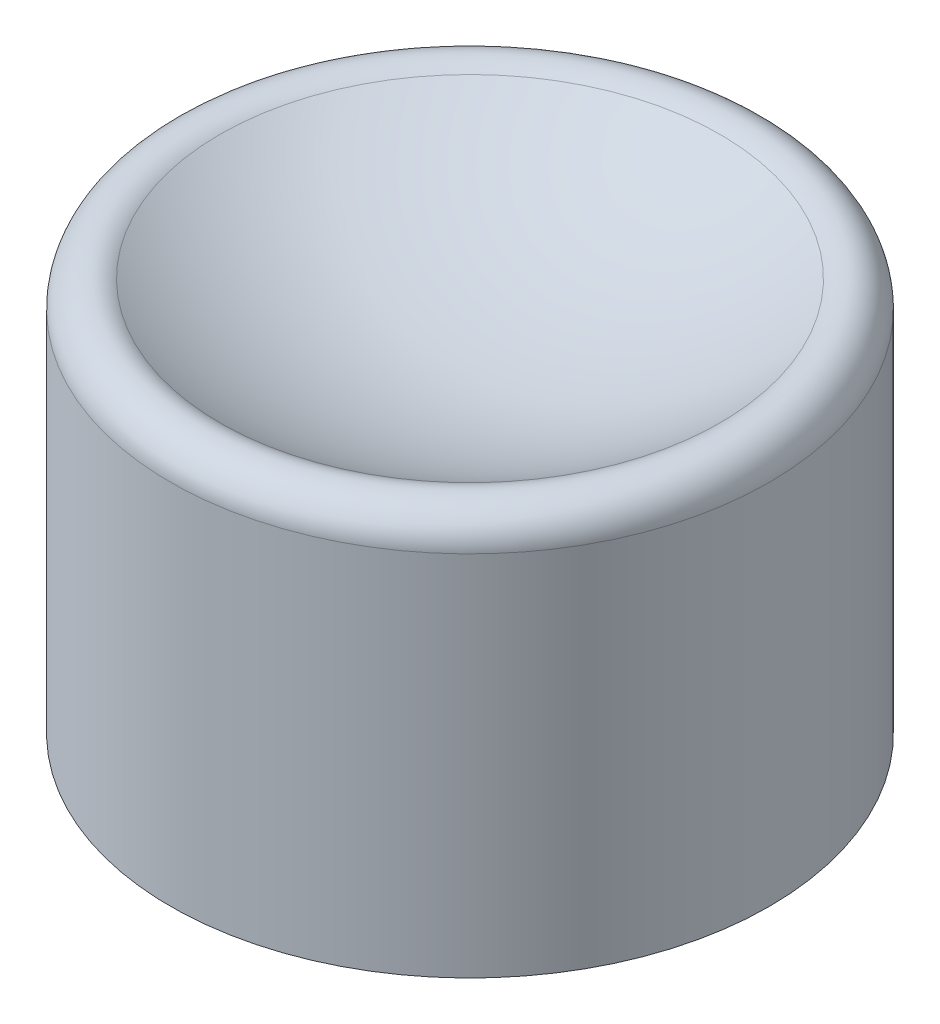
ISO-10303-21;
HEADER;
FILE_DESCRIPTION(('STEP AP214'),'2;1');
FILE_NAME('part.step','',(''),(''),'','','');
FILE_SCHEMA(('AUTOMOTIVE_DESIGN { 1 0 10303 214 1 1 1 1 }'));
ENDSEC;
DATA;
#1=APPLICATION_CONTEXT('core data for automotive mechanical design processes');
#2=APPLICATION_PROTOCOL_DEFINITION('international standard','automotive_design',2000,#1);
#3=PRODUCT_CONTEXT('',#1,'mechanical');
#4=PRODUCT('Part','Part','',(#3));
#5=PRODUCT_RELATED_PRODUCT_CATEGORY('part','',(#4));
#6=PRODUCT_DEFINITION_FORMATION('','',#4);
#7=PRODUCT_DEFINITION_CONTEXT('part definition',#1,'design');
#8=PRODUCT_DEFINITION('design','',#6,#7);
#9=PRODUCT_DEFINITION_SHAPE('','',#8);
#10=(LENGTH_UNIT() NAMED_UNIT(*) SI_UNIT(.MILLI.,.METRE.));
#11=(NAMED_UNIT(*) PLANE_ANGLE_UNIT() SI_UNIT($,.RADIAN.));
#12=(NAMED_UNIT(*) SI_UNIT($,.STERADIAN.) SOLID_ANGLE_UNIT());
#13=UNCERTAINTY_MEASURE_WITH_UNIT(LENGTH_MEASURE(1.E-05),#10,'distance_accuracy_value','');
#14=(GEOMETRIC_REPRESENTATION_CONTEXT(3) GLOBAL_UNCERTAINTY_ASSIGNED_CONTEXT((#13)) GLOBAL_UNIT_ASSIGNED_CONTEXT((#10,
#11,#12)) REPRESENTATION_CONTEXT('',''));
#15=CARTESIAN_POINT('',(0.,0.,0.));
#16=DIRECTION('',(0.,0.,1.));
#17=DIRECTION('',(1.,0.,0.));
#18=AXIS2_PLACEMENT_3D('',#15,#16,#17);
#19=CARTESIAN_POINT('',(-2.0574,0.,0.));
#20=DIRECTION('',(0.,-1.,0.));
#21=DIRECTION('',(1.,0.,0.));
#22=AXIS2_PLACEMENT_3D('',#19,#20,#21);
#23=PLANE('',#22);
#24=CARTESIAN_POINT('',(0.,0.,0.));
#25=DIRECTION('',(0.,1.,0.));
#26=DIRECTION('',(-1.,0.,0.));
#27=AXIS2_PLACEMENT_3D('',#24,#25,#26);
#28=CIRCLE('',#27,1.5494);
#29=CARTESIAN_POINT('',(-1.5494,0.,0.));
#30=VERTEX_POINT('',#29);
#31=EDGE_CURVE('E10',#30,#30,#28,.T.);
#32=ORIENTED_EDGE('',*,*,#31,.T.);
#33=EDGE_LOOP('',(#32));
#34=FACE_BOUND('',#33,.T.);
#35=CARTESIAN_POINT('',(0.,0.,0.));
#36=DIRECTION('',(0.,1.,0.));
#37=DIRECTION('',(-1.,0.,0.));
#38=AXIS2_PLACEMENT_3D('',#35,#36,#37);
#39=CIRCLE('',#38,2.0574);
#40=CARTESIAN_POINT('',(-2.0574,0.,0.));
#41=VERTEX_POINT('',#40);
#42=EDGE_CURVE('E66',#41,#41,#39,.T.);
#43=ORIENTED_EDGE('',*,*,#42,.F.);
#44=EDGE_LOOP('',(#43));
#45=FACE_BOUND('',#44,.T.);
#46=ADVANCED_FACE('F29',(#34,#45),#23,.T.);
#47=CARTESIAN_POINT('',(0.,0.,0.));
#48=DIRECTION('',(0.,1.,0.));
#49=DIRECTION('',(-1.,0.,0.));
#50=AXIS2_PLACEMENT_3D('',#47,#48,#49);
#51=CYLINDRICAL_SURFACE('',#50,1.5494);
#52=CARTESIAN_POINT('',(0.,3.048,0.));
#53=DIRECTION('',(0.,1.,0.));
#54=DIRECTION('',(-1.,0.,0.));
#55=AXIS2_PLACEMENT_3D('',#52,#53,#54);
#56=CIRCLE('',#55,1.5494);
#57=CARTESIAN_POINT('',(-1.5494,3.048,0.));
#58=VERTEX_POINT('',#57);
#59=EDGE_CURVE('E35',#58,#58,#56,.T.);
#60=ORIENTED_EDGE('',*,*,#59,.T.);
#61=EDGE_LOOP('',(#60));
#62=FACE_BOUND('',#61,.T.);
#63=ORIENTED_EDGE('',*,*,#31,.F.);
#64=EDGE_LOOP('',(#63));
#65=FACE_BOUND('',#64,.T.);
#66=ADVANCED_FACE('F74',(#62,#65),#51,.F.);
#67=CARTESIAN_POINT('',(-1.5494,3.048,0.));
#68=DIRECTION('',(0.,-1.,0.));
#69=DIRECTION('',(1.,0.,0.));
#70=AXIS2_PLACEMENT_3D('',#67,#68,#69);
#71=PLANE('',#70);
#72=CARTESIAN_POINT('',(0.,3.048,0.));
#73=DIRECTION('',(0.,1.,0.));
#74=DIRECTION('',(-1.,0.,0.));
#75=AXIS2_PLACEMENT_3D('',#72,#73,#74);
#76=CIRCLE('',#75,0.762);
#77=CARTESIAN_POINT('',(-0.762,3.048,0.));
#78=VERTEX_POINT('',#77);
#79=EDGE_CURVE('E39',#78,#78,#76,.T.);
#80=ORIENTED_EDGE('',*,*,#79,.T.);
#81=EDGE_LOOP('',(#80));
#82=FACE_BOUND('',#81,.T.);
#83=ORIENTED_EDGE('',*,*,#59,.F.);
#84=EDGE_LOOP('',(#83));
#85=FACE_BOUND('',#84,.T.);
#86=ADVANCED_FACE('F78',(#82,#85),#71,.T.);
#87=CARTESIAN_POINT('',(0.,0.,0.));
#88=DIRECTION('',(0.,1.,0.));
#89=DIRECTION('',(-1.,0.,0.));
#90=AXIS2_PLACEMENT_3D('',#87,#88,#89);
#91=CYLINDRICAL_SURFACE('',#90,0.762);
#92=CARTESIAN_POINT('',(0.,4.064,0.));
#93=DIRECTION('',(0.,1.,0.));
#94=DIRECTION('',(-1.,0.,0.));
#95=AXIS2_PLACEMENT_3D('',#92,#93,#94);
#96=CIRCLE('',#95,0.762);
#97=CARTESIAN_POINT('',(-0.762,4.064,0.));
#98=VERTEX_POINT('',#97);
#99=EDGE_CURVE('E43',#98,#98,#96,.T.);
#100=ORIENTED_EDGE('',*,*,#99,.T.);
#101=EDGE_LOOP('',(#100));
#102=FACE_BOUND('',#101,.T.);
#103=ORIENTED_EDGE('',*,*,#79,.F.);
#104=EDGE_LOOP('',(#103));
#105=FACE_BOUND('',#104,.T.);
#106=ADVANCED_FACE('F82',(#102,#105),#91,.F.);
#107=CARTESIAN_POINT('',(-0.762,4.064,0.));
#108=DIRECTION('',(0.,-1.,0.));
#109=DIRECTION('',(1.,0.,0.));
#110=AXIS2_PLACEMENT_3D('',#107,#108,#109);
#111=PLANE('',#110);
#112=ORIENTED_EDGE('',*,*,#99,.F.);
#113=EDGE_LOOP('',(#112));
#114=FACE_BOUND('',#113,.T.);
#115=ADVANCED_FACE('F89',(#114),#111,.T.);
#116=CARTESIAN_POINT('',(0.,12.3332875,0.));
#117=DIRECTION('',(0.,1.,0.));
#118=DIRECTION('',(-1.,0.,0.));
#119=AXIS2_PLACEMENT_3D('',#116,#117,#118);
#120=SPHERICAL_SURFACE('',#119,7.25328750000001);
#121=CARTESIAN_POINT('',(0.,6.26687461648599,0.));
#122=DIRECTION('',(0.,1.,0.));
#123=DIRECTION('',(-1.,0.,0.));
#124=AXIS2_PLACEMENT_3D('',#121,#122,#123);
#125=CIRCLE('',#124,3.97602996522807);
#126=CARTESIAN_POINT('',(-3.97602996522807,6.26687461648599,0.));
#127=VERTEX_POINT('',#126);
#128=EDGE_CURVE('E48',#127,#127,#125,.T.);
#129=ORIENTED_EDGE('',*,*,#128,.T.);
#130=EDGE_LOOP('',(#129));
#131=FACE_BOUND('',#130,.T.);
#132=ADVANCED_FACE('F93',(#131),#120,.F.);
#133=CARTESIAN_POINT('',(0.,5.842,0.));
#134=DIRECTION('',(0.,1.,0.));
#135=DIRECTION('',(-1.,0.,0.));
#136=AXIS2_PLACEMENT_3D('',#133,#134,#135);
#137=TOROIDAL_SURFACE('',#136,4.2545,0.508);
#138=CARTESIAN_POINT('',(0.,5.842,0.));
#139=DIRECTION('',(0.,1.,0.));
#140=DIRECTION('',(-1.,0.,0.));
#141=AXIS2_PLACEMENT_3D('',#138,#139,#140);
#142=CIRCLE('',#141,4.7625);
#143=CARTESIAN_POINT('',(-4.7625,5.842,0.));
#144=VERTEX_POINT('',#143);
#145=EDGE_CURVE('E51',#144,#144,#142,.T.);
#146=ORIENTED_EDGE('',*,*,#145,.T.);
#147=EDGE_LOOP('',(#146));
#148=FACE_BOUND('',#147,.T.);
#149=ORIENTED_EDGE('',*,*,#128,.F.);
#150=EDGE_LOOP('',(#149));
#151=FACE_BOUND('',#150,.T.);
#152=ADVANCED_FACE('F97',(#148,#151),#137,.T.);
#153=CARTESIAN_POINT('',(0.,0.,0.));
#154=DIRECTION('',(0.,1.,0.));
#155=DIRECTION('',(-1.,0.,0.));
#156=AXIS2_PLACEMENT_3D('',#153,#154,#155);
#157=CYLINDRICAL_SURFACE('',#156,4.7625);
#158=CARTESIAN_POINT('',(0.,0.,0.));
#159=DIRECTION('',(0.,1.,0.));
#160=DIRECTION('',(-1.,0.,0.));
#161=AXIS2_PLACEMENT_3D('',#158,#159,#160);
#162=CIRCLE('',#161,4.7625);
#163=CARTESIAN_POINT('',(-4.7625,0.,0.));
#164=VERTEX_POINT('',#163);
#165=EDGE_CURVE('E54',#164,#164,#162,.T.);
#166=ORIENTED_EDGE('',*,*,#165,.T.);
#167=EDGE_LOOP('',(#166));
#168=FACE_BOUND('',#167,.T.);
#169=ORIENTED_EDGE('',*,*,#145,.F.);
#170=EDGE_LOOP('',(#169));
#171=FACE_BOUND('',#170,.T.);
#172=ADVANCED_FACE('F101',(#168,#171),#157,.T.);
#173=CARTESIAN_POINT('',(-4.7625,0.,0.));
#174=DIRECTION('',(0.,-1.,0.));
#175=DIRECTION('',(1.,0.,0.));
#176=AXIS2_PLACEMENT_3D('',#173,#174,#175);
#177=PLANE('',#176);
#178=CARTESIAN_POINT('',(0.,0.,0.));
#179=DIRECTION('',(0.,1.,0.));
#180=DIRECTION('',(-1.,0.,0.));
#181=AXIS2_PLACEMENT_3D('',#178,#179,#180);
#182=CIRCLE('',#181,3.4925);
#183=CARTESIAN_POINT('',(-3.4925,0.,0.));
#184=VERTEX_POINT('',#183);
#185=EDGE_CURVE('E57',#184,#184,#182,.T.);
#186=ORIENTED_EDGE('',*,*,#185,.T.);
#187=EDGE_LOOP('',(#186));
#188=FACE_BOUND('',#187,.T.);
#189=ORIENTED_EDGE('',*,*,#165,.F.);
#190=EDGE_LOOP('',(#189));
#191=FACE_BOUND('',#190,.T.);
#192=ADVANCED_FACE('F105',(#188,#191),#177,.T.);
#193=CARTESIAN_POINT('',(0.,0.,0.));
#194=DIRECTION('',(0.,1.,0.));
#195=DIRECTION('',(-1.,0.,0.));
#196=AXIS2_PLACEMENT_3D('',#193,#194,#195);
#197=CYLINDRICAL_SURFACE('',#196,3.4925);
#198=CARTESIAN_POINT('',(0.,4.064,0.));
#199=DIRECTION('',(0.,1.,0.));
#200=DIRECTION('',(-1.,0.,0.));
#201=AXIS2_PLACEMENT_3D('',#198,#199,#200);
#202=CIRCLE('',#201,3.4925);
#203=CARTESIAN_POINT('',(-3.4925,4.064,0.));
#204=VERTEX_POINT('',#203);
#205=EDGE_CURVE('E60',#204,#204,#202,.T.);
#206=ORIENTED_EDGE('',*,*,#205,.T.);
#207=EDGE_LOOP('',(#206));
#208=FACE_BOUND('',#207,.T.);
#209=ORIENTED_EDGE('',*,*,#185,.F.);
#210=EDGE_LOOP('',(#209));
#211=FACE_BOUND('',#210,.T.);
#212=ADVANCED_FACE('F109',(#208,#211),#197,.F.);
#213=CARTESIAN_POINT('',(-3.4925,4.064,0.));
#214=DIRECTION('',(0.,-1.,0.));
#215=DIRECTION('',(1.,0.,0.));
#216=AXIS2_PLACEMENT_3D('',#213,#214,#215);
#217=PLANE('',#216);
#218=CARTESIAN_POINT('',(0.,4.064,0.));
#219=DIRECTION('',(0.,1.,0.));
#220=DIRECTION('',(-1.,0.,0.));
#221=AXIS2_PLACEMENT_3D('',#218,#219,#220);
#222=CIRCLE('',#221,2.0574);
#223=CARTESIAN_POINT('',(-2.0574,4.064,0.));
#224=VERTEX_POINT('',#223);
#225=EDGE_CURVE('E63',#224,#224,#222,.T.);
#226=ORIENTED_EDGE('',*,*,#225,.T.);
#227=EDGE_LOOP('',(#226));
#228=FACE_BOUND('',#227,.T.);
#229=ORIENTED_EDGE('',*,*,#205,.F.);
#230=EDGE_LOOP('',(#229));
#231=FACE_BOUND('',#230,.T.);
#232=ADVANCED_FACE('F113',(#228,#231),#217,.T.);
#233=CARTESIAN_POINT('',(0.,0.,0.));
#234=DIRECTION('',(0.,1.,0.));
#235=DIRECTION('',(-1.,0.,0.));
#236=AXIS2_PLACEMENT_3D('',#233,#234,#235);
#237=CYLINDRICAL_SURFACE('',#236,2.0574);
#238=ORIENTED_EDGE('',*,*,#42,.T.);
#239=EDGE_LOOP('',(#238));
#240=FACE_BOUND('',#239,.T.);
#241=ORIENTED_EDGE('',*,*,#225,.F.);
#242=EDGE_LOOP('',(#241));
#243=FACE_BOUND('',#242,.T.);
#244=ADVANCED_FACE('F70',(#240,#243),#237,.T.);
#245=CLOSED_SHELL('',(#46,#66,#86,#106,#115,#132,#152,#172,#192,#212,#232,#244));
#246=MANIFOLD_SOLID_BREP('B2',#245);
#247=ADVANCED_BREP_SHAPE_REPRESENTATION('',(#18,#246),#14);
#248=SHAPE_DEFINITION_REPRESENTATION(#9,#247);
ENDSEC;
END-ISO-10303-21;
